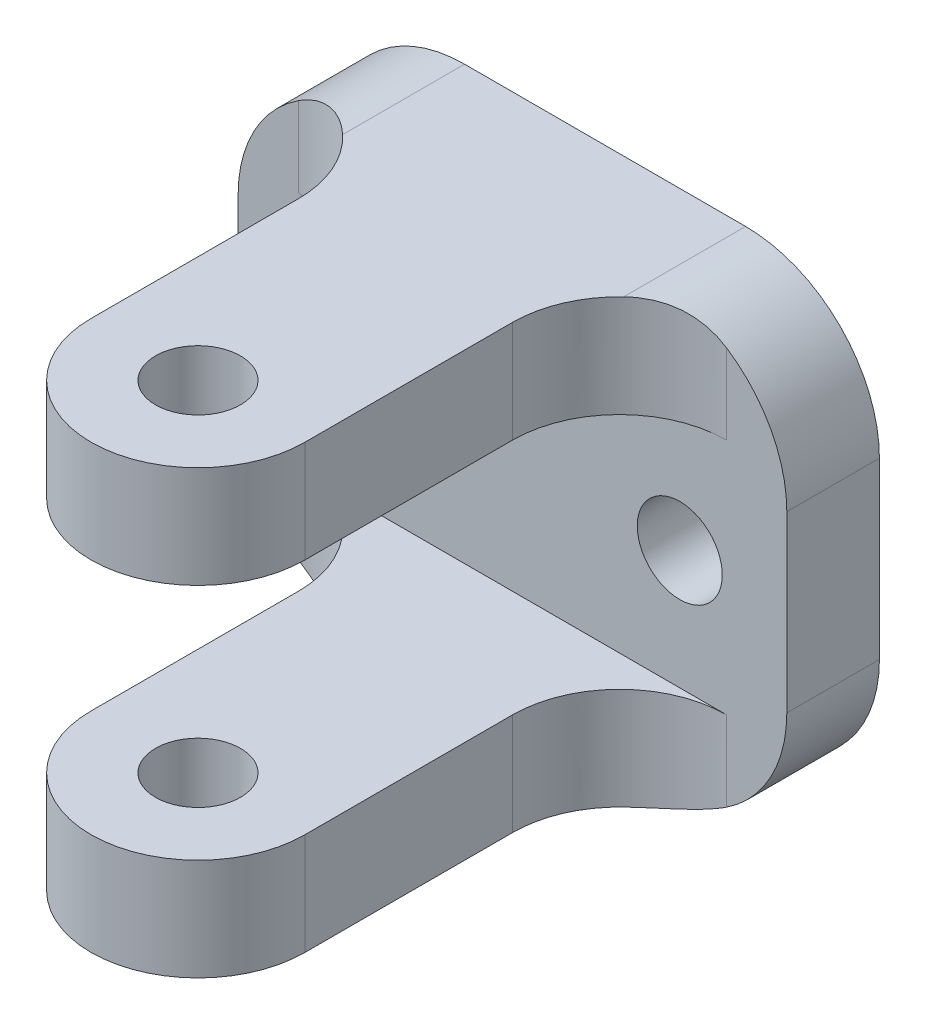
ISO-10303-21;
HEADER;
FILE_DESCRIPTION(('STEP AP214'),'2;1');
FILE_NAME('part.step','',(''),(''),'','','');
FILE_SCHEMA(('AUTOMOTIVE_DESIGN { 1 0 10303 214 1 1 1 1 }'));
ENDSEC;
DATA;
#1=APPLICATION_CONTEXT('core data for automotive mechanical design processes');
#2=APPLICATION_PROTOCOL_DEFINITION('international standard','automotive_design',2000,#1);
#3=PRODUCT_CONTEXT('',#1,'mechanical');
#4=PRODUCT('Part','Part','',(#3));
#5=PRODUCT_RELATED_PRODUCT_CATEGORY('part','',(#4));
#6=PRODUCT_DEFINITION_FORMATION('','',#4);
#7=PRODUCT_DEFINITION_CONTEXT('part definition',#1,'design');
#8=PRODUCT_DEFINITION('design','',#6,#7);
#9=PRODUCT_DEFINITION_SHAPE('','',#8);
#10=(LENGTH_UNIT() NAMED_UNIT(*) SI_UNIT(.MILLI.,.METRE.));
#11=(NAMED_UNIT(*) PLANE_ANGLE_UNIT() SI_UNIT($,.RADIAN.));
#12=(NAMED_UNIT(*) SI_UNIT($,.STERADIAN.) SOLID_ANGLE_UNIT());
#13=UNCERTAINTY_MEASURE_WITH_UNIT(LENGTH_MEASURE(1.E-05),#10,'distance_accuracy_value','');
#14=(GEOMETRIC_REPRESENTATION_CONTEXT(3) GLOBAL_UNCERTAINTY_ASSIGNED_CONTEXT((#13)) GLOBAL_UNIT_ASSIGNED_CONTEXT((#10,
#11,#12)) REPRESENTATION_CONTEXT('',''));
#15=CARTESIAN_POINT('',(0.,0.,0.));
#16=DIRECTION('',(0.,0.,1.));
#17=DIRECTION('',(1.,0.,0.));
#18=AXIS2_PLACEMENT_3D('',#15,#16,#17);
#19=CARTESIAN_POINT('',(20.5,-16.51,12.));
#20=DIRECTION('',(-1.,0.,0.));
#21=DIRECTION('',(0.,0.,1.));
#22=AXIS2_PLACEMENT_3D('',#19,#20,#21);
#23=PLANE('',#22);
#24=DIRECTION('',(0.,-1.,0.));
#25=VECTOR('',#24,1.);
#26=CARTESIAN_POINT('',(20.5,6.51,5.08));
#27=LINE('',#26,#25);
#28=CARTESIAN_POINT('',(20.5,6.51,5.08));
#29=VERTEX_POINT('',#28);
#30=CARTESIAN_POINT('',(20.5,-6.51,5.08));
#31=VERTEX_POINT('',#30);
#32=EDGE_CURVE('E188',#29,#31,#27,.T.);
#33=ORIENTED_EDGE('',*,*,#32,.F.);
#34=DIRECTION('',(0.,0.,-1.));
#35=VECTOR('',#34,1.);
#36=CARTESIAN_POINT('',(20.5,6.51,12.));
#37=LINE('',#36,#35);
#38=CARTESIAN_POINT('',(20.5,6.51,12.));
#39=VERTEX_POINT('',#38);
#40=EDGE_CURVE('E273',#29,#39,#37,.F.);
#41=ORIENTED_EDGE('',*,*,#40,.T.);
#42=DIRECTION('',(0.,1.,0.));
#43=VECTOR('',#42,1.);
#44=CARTESIAN_POINT('',(20.5,-16.51,12.));
#45=LINE('',#44,#43);
#46=CARTESIAN_POINT('',(20.5,-6.51,12.));
#47=VERTEX_POINT('',#46);
#48=EDGE_CURVE('E459',#47,#39,#45,.T.);
#49=ORIENTED_EDGE('',*,*,#48,.F.);
#50=DIRECTION('',(0.,0.,-1.));
#51=VECTOR('',#50,1.);
#52=CARTESIAN_POINT('',(20.5,-6.51,12.));
#53=LINE('',#52,#51);
#54=EDGE_CURVE('E287',#47,#31,#53,.T.);
#55=ORIENTED_EDGE('',*,*,#54,.T.);
#56=EDGE_LOOP('',(#33,#41,#49,#55));
#57=FACE_BOUND('',#56,.T.);
#58=ADVANCED_FACE('F40',(#57),#23,.F.);
#59=CARTESIAN_POINT('',(-20.5,16.51,12.));
#60=DIRECTION('',(0.,-1.,0.));
#61=DIRECTION('',(0.,0.,-1.));
#62=AXIS2_PLACEMENT_3D('',#59,#60,#61);
#63=PLANE('',#62);
#64=CARTESIAN_POINT('',(0.,16.51,35.5));
#65=DIRECTION('',(0.,-1.,0.));
#66=DIRECTION('',(0.,0.,-1.));
#67=AXIS2_PLACEMENT_3D('',#64,#65,#66);
#68=CIRCLE('',#67,3.175);
#69=CARTESIAN_POINT('',(0.,16.51,38.675));
#70=VERTEX_POINT('',#69);
#71=EDGE_CURVE('E430',#70,#70,#68,.T.);
#72=ORIENTED_EDGE('',*,*,#71,.T.);
#73=EDGE_LOOP('',(#72));
#74=FACE_BOUND('',#73,.T.);
#75=DIRECTION('',(1.,0.,0.));
#76=VECTOR('',#75,1.);
#77=CARTESIAN_POINT('',(-10.5,16.51,5.08));
#78=LINE('',#77,#76);
#79=CARTESIAN_POINT('',(-10.5,16.51,5.08));
#80=VERTEX_POINT('',#79);
#81=CARTESIAN_POINT('',(10.5,16.51,5.08));
#82=VERTEX_POINT('',#81);
#83=EDGE_CURVE('E62',#80,#82,#78,.T.);
#84=ORIENTED_EDGE('',*,*,#83,.F.);
#85=DIRECTION('',(0.,0.,-1.));
#86=VECTOR('',#85,1.);
#87=CARTESIAN_POINT('',(-10.5,16.51,12.));
#88=LINE('',#87,#86);
#89=CARTESIAN_POINT('',(-10.5,16.51,14.1905249806889));
#90=VERTEX_POINT('',#89);
#91=EDGE_CURVE('E274',#80,#90,#88,.F.);
#92=ORIENTED_EDGE('',*,*,#91,.T.);
#93=CARTESIAN_POINT('',(-16.,16.51,20.));
#94=DIRECTION('',(0.,-1.,0.));
#95=DIRECTION('',(0.,0.,-1.));
#96=AXIS2_PLACEMENT_3D('',#93,#94,#95);
#97=CIRCLE('',#96,8.);
#98=CARTESIAN_POINT('',(-8.,16.51,20.));
#99=VERTEX_POINT('',#98);
#100=EDGE_CURVE('E517',#90,#99,#97,.T.);
#101=ORIENTED_EDGE('',*,*,#100,.T.);
#102=DIRECTION('',(0.,0.,1.));
#103=VECTOR('',#102,1.);
#104=CARTESIAN_POINT('',(-8.,16.51,35.5));
#105=LINE('',#104,#103);
#106=CARTESIAN_POINT('',(-8.,16.51,35.5));
#107=VERTEX_POINT('',#106);
#108=EDGE_CURVE('E520',#99,#107,#105,.T.);
#109=ORIENTED_EDGE('',*,*,#108,.T.);
#110=CARTESIAN_POINT('',(0.,16.51,35.5));
#111=DIRECTION('',(0.,-1.,0.));
#112=DIRECTION('',(0.,0.,-1.));
#113=AXIS2_PLACEMENT_3D('',#110,#111,#112);
#114=CIRCLE('',#113,8.);
#115=CARTESIAN_POINT('',(8.,16.51,35.5));
#116=VERTEX_POINT('',#115);
#117=EDGE_CURVE('E366',#107,#116,#114,.F.);
#118=ORIENTED_EDGE('',*,*,#117,.T.);
#119=DIRECTION('',(0.,0.,-1.));
#120=VECTOR('',#119,1.);
#121=CARTESIAN_POINT('',(8.,16.51,35.5));
#122=LINE('',#121,#120);
#123=CARTESIAN_POINT('',(8.,16.51,20.));
#124=VERTEX_POINT('',#123);
#125=EDGE_CURVE('E357',#116,#124,#122,.T.);
#126=ORIENTED_EDGE('',*,*,#125,.T.);
#127=CARTESIAN_POINT('',(16.,16.51,20.));
#128=DIRECTION('',(0.,-1.,0.));
#129=DIRECTION('',(0.,0.,-1.));
#130=AXIS2_PLACEMENT_3D('',#127,#128,#129);
#131=CIRCLE('',#130,8.);
#132=CARTESIAN_POINT('',(10.5,16.51,14.1905249806889));
#133=VERTEX_POINT('',#132);
#134=EDGE_CURVE('E354',#124,#133,#131,.T.);
#135=ORIENTED_EDGE('',*,*,#134,.T.);
#136=DIRECTION('',(0.,0.,-1.));
#137=VECTOR('',#136,1.);
#138=CARTESIAN_POINT('',(10.5,16.51,12.));
#139=LINE('',#138,#137);
#140=EDGE_CURVE('E249',#133,#82,#139,.T.);
#141=ORIENTED_EDGE('',*,*,#140,.T.);
#142=EDGE_LOOP('',(#84,#92,#101,#109,#118,#126,#135,#141));
#143=FACE_BOUND('',#142,.T.);
#144=ADVANCED_FACE('F327',(#74,#143),#63,.F.);
#145=CARTESIAN_POINT('',(-20.5,-16.51,12.));
#146=DIRECTION('',(1.,0.,0.));
#147=DIRECTION('',(0.,0.,-1.));
#148=AXIS2_PLACEMENT_3D('',#145,#146,#147);
#149=PLANE('',#148);
#150=DIRECTION('',(0.,1.,0.));
#151=VECTOR('',#150,1.);
#152=CARTESIAN_POINT('',(-20.5,-6.51,5.08));
#153=LINE('',#152,#151);
#154=CARTESIAN_POINT('',(-20.5,-6.51,5.08));
#155=VERTEX_POINT('',#154);
#156=CARTESIAN_POINT('',(-20.5,6.51,5.08));
#157=VERTEX_POINT('',#156);
#158=EDGE_CURVE('E498',#155,#157,#153,.T.);
#159=ORIENTED_EDGE('',*,*,#158,.F.);
#160=DIRECTION('',(0.,0.,-1.));
#161=VECTOR('',#160,1.);
#162=CARTESIAN_POINT('',(-20.5,-6.51,12.));
#163=LINE('',#162,#161);
#164=CARTESIAN_POINT('',(-20.5,-6.51,12.));
#165=VERTEX_POINT('',#164);
#166=EDGE_CURVE('E225',#155,#165,#163,.F.);
#167=ORIENTED_EDGE('',*,*,#166,.T.);
#168=DIRECTION('',(0.,-1.,0.));
#169=VECTOR('',#168,1.);
#170=CARTESIAN_POINT('',(-20.5,-16.51,12.));
#171=LINE('',#170,#169);
#172=CARTESIAN_POINT('',(-20.5,6.51,12.));
#173=VERTEX_POINT('',#172);
#174=EDGE_CURVE('E462',#173,#165,#171,.T.);
#175=ORIENTED_EDGE('',*,*,#174,.F.);
#176=DIRECTION('',(0.,0.,-1.));
#177=VECTOR('',#176,1.);
#178=CARTESIAN_POINT('',(-20.5,6.51,12.));
#179=LINE('',#178,#177);
#180=EDGE_CURVE('E215',#173,#157,#179,.T.);
#181=ORIENTED_EDGE('',*,*,#180,.T.);
#182=EDGE_LOOP('',(#159,#167,#175,#181));
#183=FACE_BOUND('',#182,.T.);
#184=ADVANCED_FACE('F323',(#183),#149,.F.);
#185=CARTESIAN_POINT('',(-20.5,-16.51,12.));
#186=DIRECTION('',(0.,1.,0.));
#187=DIRECTION('',(0.,0.,1.));
#188=AXIS2_PLACEMENT_3D('',#185,#186,#187);
#189=PLANE('',#188);
#190=CARTESIAN_POINT('',(0.,-16.51,35.5));
#191=DIRECTION('',(0.,1.,0.));
#192=DIRECTION('',(0.,0.,1.));
#193=AXIS2_PLACEMENT_3D('',#190,#191,#192);
#194=CIRCLE('',#193,3.175);
#195=CARTESIAN_POINT('',(0.,-16.51,38.675));
#196=VERTEX_POINT('',#195);
#197=EDGE_CURVE('E434',#196,#196,#194,.F.);
#198=ORIENTED_EDGE('',*,*,#197,.F.);
#199=EDGE_LOOP('',(#198));
#200=FACE_BOUND('',#199,.T.);
#201=DIRECTION('',(-1.,0.,0.));
#202=VECTOR('',#201,1.);
#203=CARTESIAN_POINT('',(10.5,-16.51,5.08));
#204=LINE('',#203,#202);
#205=CARTESIAN_POINT('',(10.5,-16.51,5.08));
#206=VERTEX_POINT('',#205);
#207=CARTESIAN_POINT('',(-10.5,-16.51,5.08));
#208=VERTEX_POINT('',#207);
#209=EDGE_CURVE('E185',#206,#208,#204,.T.);
#210=ORIENTED_EDGE('',*,*,#209,.F.);
#211=DIRECTION('',(0.,0.,-1.));
#212=VECTOR('',#211,1.);
#213=CARTESIAN_POINT('',(10.5,-16.51,12.));
#214=LINE('',#213,#212);
#215=CARTESIAN_POINT('',(10.5,-16.51,14.1905249806889));
#216=VERTEX_POINT('',#215);
#217=EDGE_CURVE('E199',#206,#216,#214,.F.);
#218=ORIENTED_EDGE('',*,*,#217,.T.);
#219=CARTESIAN_POINT('',(16.,-16.51,20.));
#220=DIRECTION('',(0.,1.,0.));
#221=DIRECTION('',(0.,0.,1.));
#222=AXIS2_PLACEMENT_3D('',#219,#220,#221);
#223=CIRCLE('',#222,8.);
#224=CARTESIAN_POINT('',(8.,-16.51,20.));
#225=VERTEX_POINT('',#224);
#226=EDGE_CURVE('E370',#225,#216,#223,.F.);
#227=ORIENTED_EDGE('',*,*,#226,.F.);
#228=DIRECTION('',(0.,0.,-1.));
#229=VECTOR('',#228,1.);
#230=CARTESIAN_POINT('',(8.,-16.51,35.5));
#231=LINE('',#230,#229);
#232=CARTESIAN_POINT('',(8.,-16.51,35.5));
#233=VERTEX_POINT('',#232);
#234=EDGE_CURVE('E373',#233,#225,#231,.T.);
#235=ORIENTED_EDGE('',*,*,#234,.F.);
#236=CARTESIAN_POINT('',(0.,-16.51,35.5));
#237=DIRECTION('',(0.,1.,0.));
#238=DIRECTION('',(0.,0.,1.));
#239=AXIS2_PLACEMENT_3D('',#236,#237,#238);
#240=CIRCLE('',#239,8.);
#241=CARTESIAN_POINT('',(-8.,-16.51,35.5));
#242=VERTEX_POINT('',#241);
#243=EDGE_CURVE('E377',#242,#233,#240,.T.);
#244=ORIENTED_EDGE('',*,*,#243,.F.);
#245=DIRECTION('',(0.,0.,1.));
#246=VECTOR('',#245,1.);
#247=CARTESIAN_POINT('',(-8.,-16.51,35.5));
#248=LINE('',#247,#246);
#249=CARTESIAN_POINT('',(-8.,-16.51,20.));
#250=VERTEX_POINT('',#249);
#251=EDGE_CURVE('E380',#250,#242,#248,.T.);
#252=ORIENTED_EDGE('',*,*,#251,.F.);
#253=CARTESIAN_POINT('',(-16.,-16.51,20.));
#254=DIRECTION('',(0.,1.,0.));
#255=DIRECTION('',(0.,0.,1.));
#256=AXIS2_PLACEMENT_3D('',#253,#254,#255);
#257=CIRCLE('',#256,8.);
#258=CARTESIAN_POINT('',(-10.5,-16.51,14.1905249806889));
#259=VERTEX_POINT('',#258);
#260=EDGE_CURVE('E383',#259,#250,#257,.F.);
#261=ORIENTED_EDGE('',*,*,#260,.F.);
#262=DIRECTION('',(0.,0.,-1.));
#263=VECTOR('',#262,1.);
#264=CARTESIAN_POINT('',(-10.5,-16.51,12.));
#265=LINE('',#264,#263);
#266=EDGE_CURVE('E203',#259,#208,#265,.T.);
#267=ORIENTED_EDGE('',*,*,#266,.T.);
#268=EDGE_LOOP('',(#210,#218,#227,#235,#244,#252,#261,#267));
#269=FACE_BOUND('',#268,.T.);
#270=ADVANCED_FACE('F197',(#200,#269),#189,.F.);
#271=CARTESIAN_POINT('',(12.5,0.,12.));
#272=DIRECTION('',(0.,0.,-1.));
#273=DIRECTION('',(-1.,0.,0.));
#274=AXIS2_PLACEMENT_3D('',#271,#272,#273);
#275=CYLINDRICAL_SURFACE('',#274,3.175);
#276=CARTESIAN_POINT('',(12.5,0.,12.));
#277=DIRECTION('',(0.,0.,1.));
#278=DIRECTION('',(1.,0.,0.));
#279=AXIS2_PLACEMENT_3D('',#276,#277,#278);
#280=CIRCLE('',#279,3.175);
#281=CARTESIAN_POINT('',(15.675,0.,12.));
#282=VERTEX_POINT('',#281);
#283=EDGE_CURVE('E455',#282,#282,#280,.T.);
#284=ORIENTED_EDGE('',*,*,#283,.T.);
#285=EDGE_LOOP('',(#284));
#286=FACE_BOUND('',#285,.T.);
#287=CARTESIAN_POINT('',(12.5,0.,5.08));
#288=DIRECTION('',(0.,0.,-1.));
#289=DIRECTION('',(-1.,0.,0.));
#290=AXIS2_PLACEMENT_3D('',#287,#288,#289);
#291=CIRCLE('',#290,3.175);
#292=CARTESIAN_POINT('',(9.325,0.,5.08));
#293=VERTEX_POINT('',#292);
#294=EDGE_CURVE('E513',#293,#293,#291,.T.);
#295=ORIENTED_EDGE('',*,*,#294,.T.);
#296=EDGE_LOOP('',(#295));
#297=FACE_BOUND('',#296,.T.);
#298=ADVANCED_FACE('F313',(#286,#297),#275,.F.);
#299=CARTESIAN_POINT('',(-12.5,0.,12.));
#300=DIRECTION('',(0.,0.,-1.));
#301=DIRECTION('',(-1.,0.,0.));
#302=AXIS2_PLACEMENT_3D('',#299,#300,#301);
#303=CYLINDRICAL_SURFACE('',#302,3.175);
#304=CARTESIAN_POINT('',(-12.5,0.,12.));
#305=DIRECTION('',(0.,0.,1.));
#306=DIRECTION('',(1.,0.,0.));
#307=AXIS2_PLACEMENT_3D('',#304,#305,#306);
#308=CIRCLE('',#307,3.175);
#309=CARTESIAN_POINT('',(-9.325,0.,12.));
#310=VERTEX_POINT('',#309);
#311=EDGE_CURVE('E451',#310,#310,#308,.T.);
#312=ORIENTED_EDGE('',*,*,#311,.T.);
#313=EDGE_LOOP('',(#312));
#314=FACE_BOUND('',#313,.T.);
#315=CARTESIAN_POINT('',(-12.5,0.,5.08));
#316=DIRECTION('',(0.,0.,-1.));
#317=DIRECTION('',(-1.,0.,0.));
#318=AXIS2_PLACEMENT_3D('',#315,#316,#317);
#319=CIRCLE('',#318,3.175);
#320=CARTESIAN_POINT('',(-15.675,0.,5.08));
#321=VERTEX_POINT('',#320);
#322=EDGE_CURVE('E340',#321,#321,#319,.T.);
#323=ORIENTED_EDGE('',*,*,#322,.T.);
#324=EDGE_LOOP('',(#323));
#325=FACE_BOUND('',#324,.T.);
#326=ADVANCED_FACE('F310',(#314,#325),#303,.F.);
#327=CARTESIAN_POINT('',(-10.5,-6.51,12.));
#328=DIRECTION('',(0.,0.,-1.));
#329=DIRECTION('',(-1.,0.,0.));
#330=AXIS2_PLACEMENT_3D('',#327,#328,#329);
#331=CYLINDRICAL_SURFACE('',#330,10.);
#332=ORIENTED_EDGE('',*,*,#166,.F.);
#333=CARTESIAN_POINT('',(-10.5,-6.51,5.08));
#334=DIRECTION('',(0.,0.,-1.));
#335=DIRECTION('',(-1.,0.,0.));
#336=AXIS2_PLACEMENT_3D('',#333,#334,#335);
#337=CIRCLE('',#336,10.);
#338=EDGE_CURVE('E205',#208,#155,#337,.T.);
#339=ORIENTED_EDGE('',*,*,#338,.F.);
#340=ORIENTED_EDGE('',*,*,#266,.F.);
#341=CARTESIAN_POINT('',(-16.,-14.861646544245,12.));
#342=CARTESIAN_POINT('',(-15.8406390175342,-14.9666346961261,11.9999773486859));
#343=CARTESIAN_POINT('',(-15.6781927679576,-15.0670340152452,12.0047616823777));
#344=CARTESIAN_POINT('',(-15.3482407665293,-15.2581857287704,12.0248855274601));
#345=CARTESIAN_POINT('',(-15.1807322371773,-15.3489326991728,12.0402309376997));
#346=CARTESIAN_POINT('',(-14.842333925003,-15.519996597423,12.0823721509199));
#347=CARTESIAN_POINT('',(-14.6714527258065,-15.6003368427069,12.1091417572519));
#348=CARTESIAN_POINT('',(-14.3274378196099,-15.750450103068,12.1748364161036));
#349=CARTESIAN_POINT('',(-14.1543046355359,-15.8202255254262,12.2137586933301));
#350=CARTESIAN_POINT('',(-13.8065842208315,-15.9493351897276,12.3044590524056));
#351=CARTESIAN_POINT('',(-13.6319939443628,-16.0086221225154,12.3562929656252));
#352=CARTESIAN_POINT('',(-13.2838167253846,-16.1164343840874,12.4729780191308));
#353=CARTESIAN_POINT('',(-13.1102298996766,-16.1649584837042,12.5378306446067));
#354=CARTESIAN_POINT('',(-12.7658628361083,-16.2515288176306,12.6804996316999));
#355=CARTESIAN_POINT('',(-12.5950817815399,-16.2895781536468,12.758312144757));
#356=CARTESIAN_POINT('',(-12.2579466427851,-16.3557669889002,12.9266329374261));
#357=CARTESIAN_POINT('',(-12.0915917985458,-16.3839081998103,13.0171390203856));
#358=CARTESIAN_POINT('',(-11.800310226014,-16.4259421877124,13.1893684576741));
#359=CARTESIAN_POINT('',(-11.6742310763261,-16.4416019970572,13.2687318633785));
#360=CARTESIAN_POINT('',(-11.4263394869415,-16.4677821892239,13.434646170847));
#361=CARTESIAN_POINT('',(-11.3045269803384,-16.4783026526707,13.5211969598321));
#362=CARTESIAN_POINT('',(-11.065770564703,-16.4946992427489,13.7011338226893));
#363=CARTESIAN_POINT('',(-10.9488260071075,-16.5005759899568,13.7945189814075));
#364=CARTESIAN_POINT('',(-10.7202841230381,-16.5082281673317,13.9877596888987));
#365=CARTESIAN_POINT('',(-10.6086863472399,-16.5100039427237,14.0876146923045));
#366=CARTESIAN_POINT('',(-10.5,-16.51,14.1905249806889));
#367=B_SPLINE_CURVE_WITH_KNOTS('',3,(#341,#342,#343,#344,#345,#346,#347,#348,#349,#350,#351,
#352,#353,#354,#355,#356,#357,#358,#359,#360,#361,#362,#363,#364,#365,#366),.UNSPECIFIED.,.F.,
.F.,(4,2,2,2,2,2,2,2,2,2,2,2,4),(0.,0.572446979802288,1.14521395745737,1.71667453014939,
2.28800469429968,2.86184959536753,3.43575999857619,4.0095002765897,4.58314138971889,
5.03222792695074,5.48130741878281,5.93032688641021,6.37930855363194),.UNSPECIFIED.);
#368=CARTESIAN_POINT('',(-16.,-14.8616465442451,12.));
#369=VERTEX_POINT('',#368);
#370=EDGE_CURVE('E240',#369,#259,#367,.T.);
#371=ORIENTED_EDGE('',*,*,#370,.F.);
#372=CARTESIAN_POINT('',(-10.5,-6.51,12.));
#373=DIRECTION('',(0.,0.,-1.));
#374=DIRECTION('',(-1.,0.,0.));
#375=AXIS2_PLACEMENT_3D('',#372,#373,#374);
#376=CIRCLE('',#375,10.);
#377=EDGE_CURVE('E237',#165,#369,#376,.F.);
#378=ORIENTED_EDGE('',*,*,#377,.F.);
#379=EDGE_LOOP('',(#332,#339,#340,#371,#378));
#380=FACE_BOUND('',#379,.T.);
#381=ADVANCED_FACE('F251',(#380),#331,.T.);
#382=CARTESIAN_POINT('',(-10.5,6.51,12.));
#383=DIRECTION('',(0.,0.,-1.));
#384=DIRECTION('',(-1.,0.,0.));
#385=AXIS2_PLACEMENT_3D('',#382,#383,#384);
#386=CYLINDRICAL_SURFACE('',#385,10.);
#387=ORIENTED_EDGE('',*,*,#91,.F.);
#388=CARTESIAN_POINT('',(-10.5,6.51,5.08));
#389=DIRECTION('',(0.,0.,-1.));
#390=DIRECTION('',(-1.,0.,0.));
#391=AXIS2_PLACEMENT_3D('',#388,#389,#390);
#392=CIRCLE('',#391,10.);
#393=EDGE_CURVE('E501',#157,#80,#392,.T.);
#394=ORIENTED_EDGE('',*,*,#393,.F.);
#395=ORIENTED_EDGE('',*,*,#180,.F.);
#396=CARTESIAN_POINT('',(-10.5,6.51,12.));
#397=DIRECTION('',(0.,0.,-1.));
#398=DIRECTION('',(-1.,0.,0.));
#399=AXIS2_PLACEMENT_3D('',#396,#397,#398);
#400=CIRCLE('',#399,10.);
#401=CARTESIAN_POINT('',(-16.,14.861646544245,12.));
#402=VERTEX_POINT('',#401);
#403=EDGE_CURVE('E234',#402,#173,#400,.F.);
#404=ORIENTED_EDGE('',*,*,#403,.F.);
#405=CARTESIAN_POINT('',(-10.5,16.51,14.1905249806889));
#406=CARTESIAN_POINT('',(-10.6385905076174,16.5100124707479,14.0592779526813));
#407=CARTESIAN_POINT('',(-10.7819437931911,16.5071192931788,13.9330061802224));
#408=CARTESIAN_POINT('',(-11.0771804914547,16.4944198218968,13.6911043721401));
#409=CARTESIAN_POINT('',(-11.2290678650654,16.4846102932991,13.5754793447867));
#410=CARTESIAN_POINT('',(-11.5399428074204,16.4570011199483,13.3559003733543));
#411=CARTESIAN_POINT('',(-11.698915983624,16.4392170615019,13.2519241546606));
#412=CARTESIAN_POINT('',(-12.0229016970291,16.3947100739277,13.0560454081363));
#413=CARTESIAN_POINT('',(-12.1879130541584,16.3679888832069,12.9641405370845));
#414=CARTESIAN_POINT('',(-12.5232261794013,16.3046813182327,12.7925273621917));
#415=CARTESIAN_POINT('',(-12.6935470431496,16.268054507108,12.7128711985689));
#416=CARTESIAN_POINT('',(-13.0371988189976,16.1843937068261,12.5665156159983));
#417=CARTESIAN_POINT('',(-13.2105300211182,16.1373587097442,12.4998174530739));
#418=CARTESIAN_POINT('',(-13.5583864264666,16.0325656510807,12.379476053191));
#419=CARTESIAN_POINT('',(-13.7329111052907,15.9748120399576,12.3258274192429));
#420=CARTESIAN_POINT('',(-14.0814820011126,15.8484867822336,12.2313524064613));
#421=CARTESIAN_POINT('',(-14.2555282986759,15.7799170872823,12.1905237183692));
#422=CARTESIAN_POINT('',(-14.5638479921024,15.6482066096535,12.1287525423828));
#423=CARTESIAN_POINT('',(-14.69853550601,15.5871308572021,12.1054160803613));
#424=CARTESIAN_POINT('',(-14.9659083430294,15.4586122006368,12.0659649821987));
#425=CARTESIAN_POINT('',(-15.0985937899693,15.3911696921954,12.0498498976305));
#426=CARTESIAN_POINT('',(-15.3613242415198,15.250122849356,12.0244429742811));
#427=CARTESIAN_POINT('',(-15.4913689320857,15.1765177873638,12.0151519424645));
#428=CARTESIAN_POINT('',(-15.748234151168,15.0234277503611,12.0029271301925));
#429=CARTESIAN_POINT('',(-15.8750551562842,14.9439436513997,11.9999924045347));
#430=CARTESIAN_POINT('',(-16.,14.861646544245,12.));
#431=B_SPLINE_CURVE_WITH_KNOTS('',3,(#405,#406,#407,#408,#409,#410,#411,#412,#413,#414,#415,
#416,#417,#418,#419,#420,#421,#422,#423,#424,#425,#426,#427,#428,#429,#430),.UNSPECIFIED.,.F.,
.F.,(4,2,2,2,2,2,2,2,2,2,2,2,4),(0.,0.572535620150681,1.14533920190051,1.71702807985692,
2.28860582030931,2.86255303398867,3.43655585284524,4.01032087195247,4.58398247932137,
5.03282465175146,5.48163894849237,5.93050631031846,6.37930691959681),.UNSPECIFIED.);
#432=EDGE_CURVE('E266',#90,#402,#431,.T.);
#433=ORIENTED_EDGE('',*,*,#432,.F.);
#434=EDGE_LOOP('',(#387,#394,#395,#404,#433));
#435=FACE_BOUND('',#434,.T.);
#436=ADVANCED_FACE('F276',(#435),#386,.T.);
#437=CARTESIAN_POINT('',(10.5,-6.51,12.));
#438=DIRECTION('',(0.,0.,-1.));
#439=DIRECTION('',(-1.,0.,0.));
#440=AXIS2_PLACEMENT_3D('',#437,#438,#439);
#441=CYLINDRICAL_SURFACE('',#440,10.);
#442=ORIENTED_EDGE('',*,*,#217,.F.);
#443=CARTESIAN_POINT('',(10.5,-6.51,5.08));
#444=DIRECTION('',(0.,0.,-1.));
#445=DIRECTION('',(-1.,0.,0.));
#446=AXIS2_PLACEMENT_3D('',#443,#444,#445);
#447=CIRCLE('',#446,10.);
#448=EDGE_CURVE('E182',#31,#206,#447,.T.);
#449=ORIENTED_EDGE('',*,*,#448,.F.);
#450=ORIENTED_EDGE('',*,*,#54,.F.);
#451=CARTESIAN_POINT('',(10.5,-6.51,12.));
#452=DIRECTION('',(0.,0.,-1.));
#453=DIRECTION('',(-1.,0.,0.));
#454=AXIS2_PLACEMENT_3D('',#451,#452,#453);
#455=CIRCLE('',#454,10.);
#456=CARTESIAN_POINT('',(16.,-14.8616465442451,12.));
#457=VERTEX_POINT('',#456);
#458=EDGE_CURVE('E231',#457,#47,#455,.F.);
#459=ORIENTED_EDGE('',*,*,#458,.F.);
#460=CARTESIAN_POINT('',(10.5,-16.51,14.1905249806889));
#461=CARTESIAN_POINT('',(10.6385905076174,-16.5100124707479,14.0592779526813));
#462=CARTESIAN_POINT('',(10.7819437931911,-16.5071192931788,13.9330061802224));
#463=CARTESIAN_POINT('',(11.0771804914547,-16.4944198218968,13.6911043721402));
#464=CARTESIAN_POINT('',(11.2290678650654,-16.4846102932991,13.5754793447867));
#465=CARTESIAN_POINT('',(11.5399428074203,-16.4570011199483,13.3559003733543));
#466=CARTESIAN_POINT('',(11.6989159836239,-16.4392170615019,13.2519241546607));
#467=CARTESIAN_POINT('',(12.0229016970291,-16.3947100739277,13.0560454081363));
#468=CARTESIAN_POINT('',(12.1879130541584,-16.3679888832069,12.9641405370845));
#469=CARTESIAN_POINT('',(12.5232261794013,-16.3046813182327,12.7925273621918));
#470=CARTESIAN_POINT('',(12.6935470431496,-16.268054507108,12.7128711985689));
#471=CARTESIAN_POINT('',(13.0371988189976,-16.1843937068261,12.5665156159983));
#472=CARTESIAN_POINT('',(13.2105300211182,-16.1373587097442,12.4998174530739));
#473=CARTESIAN_POINT('',(13.5583864264666,-16.0325656510807,12.379476053191));
#474=CARTESIAN_POINT('',(13.7329111052907,-15.9748120399576,12.3258274192429));
#475=CARTESIAN_POINT('',(14.0814820011126,-15.8484867822336,12.2313524064613));
#476=CARTESIAN_POINT('',(14.2555282986759,-15.7799170872823,12.1905237183692));
#477=CARTESIAN_POINT('',(14.5638479921024,-15.6482066096536,12.1287525423828));
#478=CARTESIAN_POINT('',(14.69853550601,-15.5871308572021,12.1054160803613));
#479=CARTESIAN_POINT('',(14.9659083430294,-15.4586122006368,12.0659649821987));
#480=CARTESIAN_POINT('',(15.0985937899693,-15.3911696921954,12.0498498976305));
#481=CARTESIAN_POINT('',(15.3613242415198,-15.250122849356,12.0244429742811));
#482=CARTESIAN_POINT('',(15.4913689320857,-15.1765177873638,12.0151519424645));
#483=CARTESIAN_POINT('',(15.748234151168,-15.0234277503611,12.0029271301925));
#484=CARTESIAN_POINT('',(15.8750551562842,-14.9439436513997,11.9999924045347));
#485=CARTESIAN_POINT('',(16.,-14.861646544245,12.));
#486=B_SPLINE_CURVE_WITH_KNOTS('',3,(#460,#461,#462,#463,#464,#465,#466,#467,#468,#469,#470,
#471,#472,#473,#474,#475,#476,#477,#478,#479,#480,#481,#482,#483,#484,#485),.UNSPECIFIED.,.F.,
.F.,(4,2,2,2,2,2,2,2,2,2,2,2,4),(0.,0.57253562015068,1.14533920190051,1.71702807985692,
2.2886058203093,2.86255303398866,3.43655585284523,4.01032087195246,4.58398247932136,
5.03282465175145,5.48163894849236,5.93050631031846,6.37930691959681),.UNSPECIFIED.);
#487=EDGE_CURVE('E55',#216,#457,#486,.T.);
#488=ORIENTED_EDGE('',*,*,#487,.F.);
#489=EDGE_LOOP('',(#442,#449,#450,#459,#488));
#490=FACE_BOUND('',#489,.T.);
#491=ADVANCED_FACE('F208',(#490),#441,.T.);
#492=CARTESIAN_POINT('',(10.5,6.51,12.));
#493=DIRECTION('',(0.,0.,-1.));
#494=DIRECTION('',(-1.,0.,0.));
#495=AXIS2_PLACEMENT_3D('',#492,#493,#494);
#496=CYLINDRICAL_SURFACE('',#495,10.);
#497=ORIENTED_EDGE('',*,*,#40,.F.);
#498=CARTESIAN_POINT('',(10.5,6.51,5.08));
#499=DIRECTION('',(0.,0.,-1.));
#500=DIRECTION('',(-1.,0.,0.));
#501=AXIS2_PLACEMENT_3D('',#498,#499,#500);
#502=CIRCLE('',#501,10.);
#503=EDGE_CURVE('E341',#82,#29,#502,.T.);
#504=ORIENTED_EDGE('',*,*,#503,.F.);
#505=ORIENTED_EDGE('',*,*,#140,.F.);
#506=CARTESIAN_POINT('',(16.,14.861646544245,12.));
#507=CARTESIAN_POINT('',(15.8406390175342,14.9666346961261,11.9999773486859));
#508=CARTESIAN_POINT('',(15.6781927679576,15.0670340152452,12.0047616823777));
#509=CARTESIAN_POINT('',(15.3482407665293,15.2581857287704,12.0248855274601));
#510=CARTESIAN_POINT('',(15.1807322371773,15.3489326991728,12.0402309376997));
#511=CARTESIAN_POINT('',(14.842333925003,15.519996597423,12.0823721509199));
#512=CARTESIAN_POINT('',(14.6714527258065,15.6003368427069,12.1091417572519));
#513=CARTESIAN_POINT('',(14.3274378196099,15.750450103068,12.1748364161036));
#514=CARTESIAN_POINT('',(14.1543046355359,15.8202255254262,12.2137586933301));
#515=CARTESIAN_POINT('',(13.8065842208315,15.9493351897276,12.3044590524056));
#516=CARTESIAN_POINT('',(13.6319939443628,16.0086221225154,12.3562929656252));
#517=CARTESIAN_POINT('',(13.2838167253846,16.1164343840874,12.4729780191308));
#518=CARTESIAN_POINT('',(13.1102298996766,16.1649584837042,12.5378306446067));
#519=CARTESIAN_POINT('',(12.7658628361083,16.2515288176306,12.6804996316999));
#520=CARTESIAN_POINT('',(12.5950817815399,16.2895781536468,12.758312144757));
#521=CARTESIAN_POINT('',(12.2579466427851,16.3557669889002,12.9266329374261));
#522=CARTESIAN_POINT('',(12.0915917985458,16.3839081998103,13.0171390203856));
#523=CARTESIAN_POINT('',(11.800310226014,16.4259421877124,13.1893684576741));
#524=CARTESIAN_POINT('',(11.6742310763261,16.4416019970572,13.2687318633785));
#525=CARTESIAN_POINT('',(11.4263394869415,16.4677821892239,13.434646170847));
#526=CARTESIAN_POINT('',(11.3045269803384,16.4783026526707,13.5211969598321));
#527=CARTESIAN_POINT('',(11.065770564703,16.4946992427489,13.7011338226893));
#528=CARTESIAN_POINT('',(10.9488260071075,16.5005759899568,13.7945189814075));
#529=CARTESIAN_POINT('',(10.7202841230381,16.5082281673317,13.9877596888987));
#530=CARTESIAN_POINT('',(10.6086863472398,16.5100039427237,14.0876146923045));
#531=CARTESIAN_POINT('',(10.5,16.51,14.1905249806889));
#532=B_SPLINE_CURVE_WITH_KNOTS('',3,(#506,#507,#508,#509,#510,#511,#512,#513,#514,#515,#516,
#517,#518,#519,#520,#521,#522,#523,#524,#525,#526,#527,#528,#529,#530,#531),.UNSPECIFIED.,.F.,
.F.,(4,2,2,2,2,2,2,2,2,2,2,2,4),(0.,0.572446979802291,1.14521395745738,1.7166745301494,
2.28800469429969,2.86184959536755,3.43575999857621,4.00950027658972,4.58314138971892,
5.03222792695077,5.48130741878283,5.93032688641024,6.37930855363197),.UNSPECIFIED.);
#533=CARTESIAN_POINT('',(16.,14.861646544245,12.));
#534=VERTEX_POINT('',#533);
#535=EDGE_CURVE('E11',#534,#133,#532,.T.);
#536=ORIENTED_EDGE('',*,*,#535,.F.);
#537=CARTESIAN_POINT('',(10.5,6.51,12.));
#538=DIRECTION('',(0.,0.,-1.));
#539=DIRECTION('',(-1.,0.,0.));
#540=AXIS2_PLACEMENT_3D('',#537,#538,#539);
#541=CIRCLE('',#540,10.);
#542=EDGE_CURVE('E228',#39,#534,#541,.F.);
#543=ORIENTED_EDGE('',*,*,#542,.F.);
#544=EDGE_LOOP('',(#497,#504,#505,#536,#543));
#545=FACE_BOUND('',#544,.T.);
#546=ADVANCED_FACE('F42',(#545),#496,.T.);
#547=CARTESIAN_POINT('',(0.,0.,12.));
#548=DIRECTION('',(0.,0.,-1.));
#549=DIRECTION('',(-1.,0.,0.));
#550=AXIS2_PLACEMENT_3D('',#547,#548,#549);
#551=PLANE('',#550);
#552=ORIENTED_EDGE('',*,*,#174,.T.);
#553=ORIENTED_EDGE('',*,*,#377,.T.);
#554=DIRECTION('',(0.,1.,0.));
#555=VECTOR('',#554,1.);
#556=CARTESIAN_POINT('',(-16.,-83.5174622710038,12.));
#557=LINE('',#556,#555);
#558=CARTESIAN_POINT('',(-16.,-8.89000000000002,12.));
#559=VERTEX_POINT('',#558);
#560=EDGE_CURVE('E374',#369,#559,#557,.T.);
#561=ORIENTED_EDGE('',*,*,#560,.T.);
#562=DIRECTION('',(-1.,0.,0.));
#563=VECTOR('',#562,1.);
#564=CARTESIAN_POINT('',(-20.5,-8.89,12.));
#565=LINE('',#564,#563);
#566=CARTESIAN_POINT('',(16.,-8.89000000000001,12.));
#567=VERTEX_POINT('',#566);
#568=EDGE_CURVE('E443',#567,#559,#565,.T.);
#569=ORIENTED_EDGE('',*,*,#568,.F.);
#570=DIRECTION('',(0.,1.,0.));
#571=VECTOR('',#570,1.);
#572=CARTESIAN_POINT('',(16.,-83.5174622710038,12.));
#573=LINE('',#572,#571);
#574=EDGE_CURVE('E364',#457,#567,#573,.T.);
#575=ORIENTED_EDGE('',*,*,#574,.F.);
#576=ORIENTED_EDGE('',*,*,#458,.T.);
#577=ORIENTED_EDGE('',*,*,#48,.T.);
#578=ORIENTED_EDGE('',*,*,#542,.T.);
#579=CARTESIAN_POINT('',(16.,8.89,12.));
#580=VERTEX_POINT('',#579);
#581=EDGE_CURVE('E360',#580,#534,#573,.T.);
#582=ORIENTED_EDGE('',*,*,#581,.F.);
#583=DIRECTION('',(1.,0.,0.));
#584=VECTOR('',#583,1.);
#585=CARTESIAN_POINT('',(-20.5,8.89,12.));
#586=LINE('',#585,#584);
#587=CARTESIAN_POINT('',(-16.,8.88999999999997,12.));
#588=VERTEX_POINT('',#587);
#589=EDGE_CURVE('E447',#588,#580,#586,.T.);
#590=ORIENTED_EDGE('',*,*,#589,.F.);
#591=EDGE_CURVE('E389',#588,#402,#557,.T.);
#592=ORIENTED_EDGE('',*,*,#591,.T.);
#593=ORIENTED_EDGE('',*,*,#403,.T.);
#594=EDGE_LOOP('',(#552,#553,#561,#569,#575,#576,#577,#578,#582,#590,#592,#593));
#595=FACE_BOUND('',#594,.T.);
#596=ORIENTED_EDGE('',*,*,#311,.F.);
#597=EDGE_LOOP('',(#596));
#598=FACE_BOUND('',#597,.T.);
#599=ORIENTED_EDGE('',*,*,#283,.F.);
#600=EDGE_LOOP('',(#599));
#601=FACE_BOUND('',#600,.T.);
#602=ADVANCED_FACE('F308',(#595,#598,#601),#551,.F.);
#603=CARTESIAN_POINT('',(-20.5,8.89,65.));
#604=DIRECTION('',(0.,1.,0.));
#605=DIRECTION('',(-1.,0.,0.));
#606=AXIS2_PLACEMENT_3D('',#603,#604,#605);
#607=PLANE('',#606);
#608=CARTESIAN_POINT('',(0.,8.89,35.5));
#609=DIRECTION('',(0.,1.,0.));
#610=DIRECTION('',(-1.,0.,0.));
#611=AXIS2_PLACEMENT_3D('',#608,#609,#610);
#612=CIRCLE('',#611,3.175);
#613=CARTESIAN_POINT('',(0.,8.89,38.675));
#614=VERTEX_POINT('',#613);
#615=EDGE_CURVE('E439',#614,#614,#612,.T.);
#616=ORIENTED_EDGE('',*,*,#615,.T.);
#617=EDGE_LOOP('',(#616));
#618=FACE_BOUND('',#617,.T.);
#619=DIRECTION('',(0.,0.,-1.));
#620=VECTOR('',#619,1.);
#621=CARTESIAN_POINT('',(-8.,8.89,65.));
#622=LINE('',#621,#620);
#623=CARTESIAN_POINT('',(-8.,8.88999999999997,35.5));
#624=VERTEX_POINT('',#623);
#625=CARTESIAN_POINT('',(-8.,8.88999999999997,20.));
#626=VERTEX_POINT('',#625);
#627=EDGE_CURVE('E422',#624,#626,#622,.T.);
#628=ORIENTED_EDGE('',*,*,#627,.T.);
#629=CARTESIAN_POINT('',(-16.,8.89,20.));
#630=DIRECTION('',(0.,1.,0.));
#631=DIRECTION('',(-1.,0.,0.));
#632=AXIS2_PLACEMENT_3D('',#629,#630,#631);
#633=CIRCLE('',#632,8.);
#634=EDGE_CURVE('E426',#626,#588,#633,.T.);
#635=ORIENTED_EDGE('',*,*,#634,.T.);
#636=ORIENTED_EDGE('',*,*,#589,.T.);
#637=CARTESIAN_POINT('',(16.,8.89,20.));
#638=DIRECTION('',(0.,1.,0.));
#639=DIRECTION('',(-1.,0.,0.));
#640=AXIS2_PLACEMENT_3D('',#637,#638,#639);
#641=CIRCLE('',#640,8.);
#642=CARTESIAN_POINT('',(8.,8.88999999999997,20.));
#643=VERTEX_POINT('',#642);
#644=EDGE_CURVE('E386',#580,#643,#641,.T.);
#645=ORIENTED_EDGE('',*,*,#644,.T.);
#646=DIRECTION('',(0.,0.,1.));
#647=VECTOR('',#646,1.);
#648=CARTESIAN_POINT('',(8.,8.89,65.));
#649=LINE('',#648,#647);
#650=CARTESIAN_POINT('',(8.,8.88999999999997,35.5));
#651=VERTEX_POINT('',#650);
#652=EDGE_CURVE('E414',#643,#651,#649,.T.);
#653=ORIENTED_EDGE('',*,*,#652,.T.);
#654=CARTESIAN_POINT('',(0.,8.89,35.5));
#655=DIRECTION('',(0.,1.,0.));
#656=DIRECTION('',(-1.,0.,0.));
#657=AXIS2_PLACEMENT_3D('',#654,#655,#656);
#658=CIRCLE('',#657,8.);
#659=EDGE_CURVE('E418',#651,#624,#658,.F.);
#660=ORIENTED_EDGE('',*,*,#659,.T.);
#661=EDGE_LOOP('',(#628,#635,#636,#645,#653,#660));
#662=FACE_BOUND('',#661,.T.);
#663=ADVANCED_FACE('F304',(#618,#662),#607,.F.);
#664=CARTESIAN_POINT('',(-20.5,-8.89,65.));
#665=DIRECTION('',(0.,-1.,0.));
#666=DIRECTION('',(1.,0.,0.));
#667=AXIS2_PLACEMENT_3D('',#664,#665,#666);
#668=PLANE('',#667);
#669=CARTESIAN_POINT('',(0.,-8.88999999999999,35.5));
#670=DIRECTION('',(0.,-1.,0.));
#671=DIRECTION('',(1.,0.,0.));
#672=AXIS2_PLACEMENT_3D('',#669,#670,#671);
#673=CIRCLE('',#672,3.175);
#674=CARTESIAN_POINT('',(0.,-8.88999999999999,38.675));
#675=VERTEX_POINT('',#674);
#676=EDGE_CURVE('E438',#675,#675,#673,.T.);
#677=ORIENTED_EDGE('',*,*,#676,.T.);
#678=EDGE_LOOP('',(#677));
#679=FACE_BOUND('',#678,.T.);
#680=ORIENTED_EDGE('',*,*,#568,.T.);
#681=CARTESIAN_POINT('',(-16.,-8.89,20.));
#682=DIRECTION('',(0.,-1.,0.));
#683=DIRECTION('',(1.,0.,0.));
#684=AXIS2_PLACEMENT_3D('',#681,#682,#683);
#685=CIRCLE('',#684,8.);
#686=CARTESIAN_POINT('',(-8.,-8.89000000000002,20.));
#687=VERTEX_POINT('',#686);
#688=EDGE_CURVE('E211',#559,#687,#685,.T.);
#689=ORIENTED_EDGE('',*,*,#688,.T.);
#690=DIRECTION('',(0.,0.,1.));
#691=VECTOR('',#690,1.);
#692=CARTESIAN_POINT('',(-8.,-8.89,65.));
#693=LINE('',#692,#691);
#694=CARTESIAN_POINT('',(-8.,-8.89000000000002,35.5));
#695=VERTEX_POINT('',#694);
#696=EDGE_CURVE('E218',#687,#695,#693,.T.);
#697=ORIENTED_EDGE('',*,*,#696,.T.);
#698=CARTESIAN_POINT('',(0.,-8.89,35.5));
#699=DIRECTION('',(0.,-1.,0.));
#700=DIRECTION('',(1.,0.,0.));
#701=AXIS2_PLACEMENT_3D('',#698,#699,#700);
#702=CIRCLE('',#701,8.);
#703=CARTESIAN_POINT('',(8.,-8.89000000000002,35.5));
#704=VERTEX_POINT('',#703);
#705=EDGE_CURVE('E477',#695,#704,#702,.F.);
#706=ORIENTED_EDGE('',*,*,#705,.T.);
#707=DIRECTION('',(0.,0.,-1.));
#708=VECTOR('',#707,1.);
#709=CARTESIAN_POINT('',(8.,-8.88999999999999,65.));
#710=LINE('',#709,#708);
#711=CARTESIAN_POINT('',(8.,-8.89000000000001,20.));
#712=VERTEX_POINT('',#711);
#713=EDGE_CURVE('E473',#704,#712,#710,.T.);
#714=ORIENTED_EDGE('',*,*,#713,.T.);
#715=CARTESIAN_POINT('',(16.,-8.88999999999998,20.));
#716=DIRECTION('',(0.,-1.,0.));
#717=DIRECTION('',(1.,0.,0.));
#718=AXIS2_PLACEMENT_3D('',#715,#716,#717);
#719=CIRCLE('',#718,8.);
#720=EDGE_CURVE('E466',#712,#567,#719,.T.);
#721=ORIENTED_EDGE('',*,*,#720,.T.);
#722=EDGE_LOOP('',(#680,#689,#697,#706,#714,#721));
#723=FACE_BOUND('',#722,.T.);
#724=ADVANCED_FACE('F301',(#679,#723),#668,.F.);
#725=CARTESIAN_POINT('',(0.,-25.4902561210691,35.5));
#726=DIRECTION('',(0.,1.,0.));
#727=DIRECTION('',(0.,0.,1.));
#728=AXIS2_PLACEMENT_3D('',#725,#726,#727);
#729=CYLINDRICAL_SURFACE('',#728,3.175);
#730=CARTESIAN_POINT('',(0.,-16.51,38.675));
#731=CARTESIAN_POINT('',(0.,-16.430625,38.675));
#732=CARTESIAN_POINT('',(0.,-16.35125,38.675));
#733=CARTESIAN_POINT('',(0.,-16.1925,38.675));
#734=CARTESIAN_POINT('',(0.,-16.113125,38.675));
#735=CARTESIAN_POINT('',(0.,-15.954375,38.675));
#736=CARTESIAN_POINT('',(0.,-15.875,38.675));
#737=CARTESIAN_POINT('',(0.,-15.71625,38.675));
#738=CARTESIAN_POINT('',(0.,-15.636875,38.675));
#739=CARTESIAN_POINT('',(0.,-15.478125,38.675));
#740=CARTESIAN_POINT('',(0.,-15.39875,38.675));
#741=CARTESIAN_POINT('',(0.,-15.24,38.675));
#742=CARTESIAN_POINT('',(0.,-15.160625,38.675));
#743=CARTESIAN_POINT('',(0.,-15.001875,38.675));
#744=CARTESIAN_POINT('',(0.,-14.9225,38.675));
#745=CARTESIAN_POINT('',(0.,-14.76375,38.675));
#746=CARTESIAN_POINT('',(0.,-14.684375,38.675));
#747=CARTESIAN_POINT('',(0.,-14.525625,38.675));
#748=CARTESIAN_POINT('',(0.,-14.44625,38.675));
#749=CARTESIAN_POINT('',(0.,-14.2875,38.675));
#750=CARTESIAN_POINT('',(0.,-14.208125,38.675));
#751=CARTESIAN_POINT('',(0.,-14.049375,38.675));
#752=CARTESIAN_POINT('',(0.,-13.97,38.675));
#753=CARTESIAN_POINT('',(0.,-13.81125,38.675));
#754=CARTESIAN_POINT('',(0.,-13.731875,38.675));
#755=CARTESIAN_POINT('',(0.,-13.573125,38.675));
#756=CARTESIAN_POINT('',(0.,-13.49375,38.675));
#757=CARTESIAN_POINT('',(0.,-13.335,38.675));
#758=CARTESIAN_POINT('',(0.,-13.255625,38.675));
#759=CARTESIAN_POINT('',(0.,-13.096875,38.675));
#760=CARTESIAN_POINT('',(0.,-13.0175,38.675));
#761=CARTESIAN_POINT('',(0.,-12.85875,38.675));
#762=CARTESIAN_POINT('',(0.,-12.779375,38.675));
#763=CARTESIAN_POINT('',(0.,-12.620625,38.675));
#764=CARTESIAN_POINT('',(0.,-12.54125,38.675));
#765=CARTESIAN_POINT('',(0.,-12.3825,38.675));
#766=CARTESIAN_POINT('',(0.,-12.303125,38.675));
#767=CARTESIAN_POINT('',(0.,-12.144375,38.675));
#768=CARTESIAN_POINT('',(0.,-12.065,38.675));
#769=CARTESIAN_POINT('',(0.,-11.90625,38.675));
#770=CARTESIAN_POINT('',(0.,-11.826875,38.675));
#771=CARTESIAN_POINT('',(0.,-11.668125,38.675));
#772=CARTESIAN_POINT('',(0.,-11.58875,38.675));
#773=CARTESIAN_POINT('',(0.,-11.43,38.675));
#774=CARTESIAN_POINT('',(0.,-11.350625,38.675));
#775=CARTESIAN_POINT('',(0.,-11.191875,38.675));
#776=CARTESIAN_POINT('',(0.,-11.1125,38.675));
#777=CARTESIAN_POINT('',(0.,-10.95375,38.675));
#778=CARTESIAN_POINT('',(0.,-10.874375,38.675));
#779=CARTESIAN_POINT('',(0.,-10.715625,38.675));
#780=CARTESIAN_POINT('',(0.,-10.63625,38.675));
#781=CARTESIAN_POINT('',(0.,-10.4775,38.675));
#782=CARTESIAN_POINT('',(0.,-10.398125,38.675));
#783=CARTESIAN_POINT('',(0.,-10.239375,38.675));
#784=CARTESIAN_POINT('',(0.,-10.16,38.675));
#785=CARTESIAN_POINT('',(0.,-10.00125,38.675));
#786=CARTESIAN_POINT('',(0.,-9.92187499999999,38.675));
#787=CARTESIAN_POINT('',(0.,-9.76312499999999,38.675));
#788=CARTESIAN_POINT('',(0.,-9.68374999999999,38.675));
#789=CARTESIAN_POINT('',(0.,-9.52499999999999,38.675));
#790=CARTESIAN_POINT('',(0.,-9.44562499999999,38.675));
#791=CARTESIAN_POINT('',(0.,-9.28687499999999,38.675));
#792=CARTESIAN_POINT('',(0.,-9.20749999999999,38.675));
#793=CARTESIAN_POINT('',(0.,-9.04874999999999,38.675));
#794=CARTESIAN_POINT('',(0.,-8.96937499999999,38.675));
#795=CARTESIAN_POINT('',(0.,-8.88999999999999,38.675));
#796=B_SPLINE_CURVE_WITH_KNOTS('',3,(#730,#731,#732,#733,#734,#735,#736,#737,#738,#739,#740,
#741,#742,#743,#744,#745,#746,#747,#748,#749,#750,#751,#752,#753,#754,#755,#756,#757,#758,#759,
#760,#761,#762,#763,#764,#765,#766,#767,#768,#769,#770,#771,#772,#773,#774,#775,#776,#777,#778,
#779,#780,#781,#782,#783,#784,#785,#786,#787,#788,#789,#790,#791,#792,#793,#794,#795),
.UNSPECIFIED.,.F.,.F.,(4,2,2,2,2,2,2,2,2,2,2,2,2,2,2,2,2,2,2,2,2,2,2,2,2,2,2,2,2,2,2,2,4),(0.,
0.238125000000002,0.476250000000004,0.714375000000003,0.952500000000004,1.190625,1.42875,
1.66687500000001,1.90500000000001,2.14312500000001,2.38125000000001,2.61937500000001,
2.85750000000001,3.09562500000001,3.33375000000001,3.57187500000001,3.81000000000001,
4.04812500000001,4.28625000000001,4.52437500000001,4.76250000000001,5.00062500000001,
5.23875000000001,5.47687500000001,5.71500000000001,5.95312500000001,6.19125000000001,
6.42937500000001,6.66750000000001,6.90562500000001,7.14375000000001,7.38187500000002,
7.62000000000002),.UNSPECIFIED.);
#797=EDGE_CURVE('BSEAM299',#196,#675,#796,.T.);
#798=ORIENTED_EDGE('',*,*,#197,.T.);
#799=ORIENTED_EDGE('',*,*,#676,.F.);
#800=ORIENTED_EDGE('',*,*,#797,.T.);
#801=ORIENTED_EDGE('',*,*,#797,.F.);
#802=EDGE_LOOP('',(#798,#800,#799,#801));
#803=FACE_BOUND('',#802,.T.);
#804=ADVANCED_FACE('F299',(#803),#729,.F.);
#805=CARTESIAN_POINT('',(0.,16.51,38.675));
#806=CARTESIAN_POINT('',(0.,16.430625,38.675));
#807=CARTESIAN_POINT('',(0.,16.35125,38.675));
#808=CARTESIAN_POINT('',(0.,16.1925,38.675));
#809=CARTESIAN_POINT('',(0.,16.113125,38.675));
#810=CARTESIAN_POINT('',(0.,15.954375,38.675));
#811=CARTESIAN_POINT('',(0.,15.875,38.675));
#812=CARTESIAN_POINT('',(0.,15.71625,38.675));
#813=CARTESIAN_POINT('',(0.,15.636875,38.675));
#814=CARTESIAN_POINT('',(0.,15.478125,38.675));
#815=CARTESIAN_POINT('',(0.,15.39875,38.675));
#816=CARTESIAN_POINT('',(0.,15.24,38.675));
#817=CARTESIAN_POINT('',(0.,15.160625,38.675));
#818=CARTESIAN_POINT('',(0.,15.001875,38.675));
#819=CARTESIAN_POINT('',(0.,14.9225,38.675));
#820=CARTESIAN_POINT('',(0.,14.76375,38.675));
#821=CARTESIAN_POINT('',(0.,14.684375,38.675));
#822=CARTESIAN_POINT('',(0.,14.525625,38.675));
#823=CARTESIAN_POINT('',(0.,14.44625,38.675));
#824=CARTESIAN_POINT('',(0.,14.2875,38.675));
#825=CARTESIAN_POINT('',(0.,14.208125,38.675));
#826=CARTESIAN_POINT('',(0.,14.049375,38.675));
#827=CARTESIAN_POINT('',(0.,13.97,38.675));
#828=CARTESIAN_POINT('',(0.,13.81125,38.675));
#829=CARTESIAN_POINT('',(0.,13.731875,38.675));
#830=CARTESIAN_POINT('',(0.,13.573125,38.675));
#831=CARTESIAN_POINT('',(0.,13.49375,38.675));
#832=CARTESIAN_POINT('',(0.,13.335,38.675));
#833=CARTESIAN_POINT('',(0.,13.255625,38.675));
#834=CARTESIAN_POINT('',(0.,13.096875,38.675));
#835=CARTESIAN_POINT('',(0.,13.0175,38.675));
#836=CARTESIAN_POINT('',(0.,12.85875,38.675));
#837=CARTESIAN_POINT('',(0.,12.779375,38.675));
#838=CARTESIAN_POINT('',(0.,12.620625,38.675));
#839=CARTESIAN_POINT('',(0.,12.54125,38.675));
#840=CARTESIAN_POINT('',(0.,12.3825,38.675));
#841=CARTESIAN_POINT('',(0.,12.303125,38.675));
#842=CARTESIAN_POINT('',(0.,12.144375,38.675));
#843=CARTESIAN_POINT('',(0.,12.065,38.675));
#844=CARTESIAN_POINT('',(0.,11.90625,38.675));
#845=CARTESIAN_POINT('',(0.,11.826875,38.675));
#846=CARTESIAN_POINT('',(0.,11.668125,38.675));
#847=CARTESIAN_POINT('',(0.,11.58875,38.675));
#848=CARTESIAN_POINT('',(0.,11.43,38.675));
#849=CARTESIAN_POINT('',(0.,11.350625,38.675));
#850=CARTESIAN_POINT('',(0.,11.191875,38.675));
#851=CARTESIAN_POINT('',(0.,11.1125,38.675));
#852=CARTESIAN_POINT('',(0.,10.95375,38.675));
#853=CARTESIAN_POINT('',(0.,10.874375,38.675));
#854=CARTESIAN_POINT('',(0.,10.715625,38.675));
#855=CARTESIAN_POINT('',(0.,10.63625,38.675));
#856=CARTESIAN_POINT('',(0.,10.4775,38.675));
#857=CARTESIAN_POINT('',(0.,10.398125,38.675));
#858=CARTESIAN_POINT('',(0.,10.239375,38.675));
#859=CARTESIAN_POINT('',(0.,10.16,38.675));
#860=CARTESIAN_POINT('',(0.,10.00125,38.675));
#861=CARTESIAN_POINT('',(0.,9.921875,38.675));
#862=CARTESIAN_POINT('',(0.,9.763125,38.675));
#863=CARTESIAN_POINT('',(0.,9.68375,38.675));
#864=CARTESIAN_POINT('',(0.,9.525,38.675));
#865=CARTESIAN_POINT('',(0.,9.445625,38.675));
#866=CARTESIAN_POINT('',(0.,9.286875,38.675));
#867=CARTESIAN_POINT('',(0.,9.2075,38.675));
#868=CARTESIAN_POINT('',(0.,9.04875,38.675));
#869=CARTESIAN_POINT('',(0.,8.969375,38.675));
#870=CARTESIAN_POINT('',(0.,8.89,38.675));
#871=B_SPLINE_CURVE_WITH_KNOTS('',3,(#805,#806,#807,#808,#809,#810,#811,#812,#813,#814,#815,
#816,#817,#818,#819,#820,#821,#822,#823,#824,#825,#826,#827,#828,#829,#830,#831,#832,#833,#834,
#835,#836,#837,#838,#839,#840,#841,#842,#843,#844,#845,#846,#847,#848,#849,#850,#851,#852,#853,
#854,#855,#856,#857,#858,#859,#860,#861,#862,#863,#864,#865,#866,#867,#868,#869,#870),
.UNSPECIFIED.,.F.,.F.,(4,2,2,2,2,2,2,2,2,2,2,2,2,2,2,2,2,2,2,2,2,2,2,2,2,2,2,2,2,2,2,2,4),(0.,
0.238124999999999,0.476249999999998,0.714375000000003,0.952500000000002,1.190625,1.42875,
1.666875,1.905,2.143125,2.38125,2.619375,2.8575,3.095625,3.33375,3.571875,3.81,4.048125,4.28625,
4.524375,4.7625,5.000625,5.23875,5.476875,5.715,5.953125,6.19125,6.429375,6.6675,6.905625,
7.14375,7.381875,7.62),.UNSPECIFIED.);
#872=EDGE_CURVE('BSEAM295',#70,#614,#871,.T.);
#873=ORIENTED_EDGE('',*,*,#71,.F.);
#874=ORIENTED_EDGE('',*,*,#615,.F.);
#875=ORIENTED_EDGE('',*,*,#872,.T.);
#876=ORIENTED_EDGE('',*,*,#872,.F.);
#877=EDGE_LOOP('',(#873,#875,#874,#876));
#878=FACE_BOUND('',#877,.T.);
#879=ADVANCED_FACE('F295',(#878),#729,.F.);
#880=CARTESIAN_POINT('',(16.,-83.5174622710038,20.));
#881=DIRECTION('',(0.,1.,0.));
#882=DIRECTION('',(0.,0.,1.));
#883=AXIS2_PLACEMENT_3D('',#880,#881,#882);
#884=CYLINDRICAL_SURFACE('',#883,8.);
#885=ORIENTED_EDGE('',*,*,#226,.T.);
#886=ORIENTED_EDGE('',*,*,#487,.T.);
#887=ORIENTED_EDGE('',*,*,#574,.T.);
#888=ORIENTED_EDGE('',*,*,#720,.F.);
#889=DIRECTION('',(0.,1.,0.));
#890=VECTOR('',#889,1.);
#891=CARTESIAN_POINT('',(8.,-83.5174622710038,20.));
#892=LINE('',#891,#890);
#893=EDGE_CURVE('E405',#225,#712,#892,.T.);
#894=ORIENTED_EDGE('',*,*,#893,.F.);
#895=EDGE_LOOP('',(#885,#886,#887,#888,#894));
#896=FACE_BOUND('',#895,.T.);
#897=ADVANCED_FACE('F294',(#896),#884,.F.);
#898=CARTESIAN_POINT('',(8.,-83.5174622710038,35.5));
#899=DIRECTION('',(-1.,0.,0.));
#900=DIRECTION('',(0.,0.,1.));
#901=AXIS2_PLACEMENT_3D('',#898,#899,#900);
#902=PLANE('',#901);
#903=DIRECTION('',(0.,1.,0.));
#904=VECTOR('',#903,1.);
#905=CARTESIAN_POINT('',(8.,-83.5174622710038,35.5));
#906=LINE('',#905,#904);
#907=EDGE_CURVE('E400',#233,#704,#906,.T.);
#908=ORIENTED_EDGE('',*,*,#907,.F.);
#909=ORIENTED_EDGE('',*,*,#234,.T.);
#910=ORIENTED_EDGE('',*,*,#893,.T.);
#911=ORIENTED_EDGE('',*,*,#713,.F.);
#912=EDGE_LOOP('',(#908,#909,#910,#911));
#913=FACE_BOUND('',#912,.T.);
#914=ADVANCED_FACE('F552',(#913),#902,.F.);
#915=CARTESIAN_POINT('',(0.,-83.5174622710038,35.5));
#916=DIRECTION('',(0.,1.,0.));
#917=DIRECTION('',(0.,0.,1.));
#918=AXIS2_PLACEMENT_3D('',#915,#916,#917);
#919=CYLINDRICAL_SURFACE('',#918,8.);
#920=DIRECTION('',(0.,1.,0.));
#921=VECTOR('',#920,1.);
#922=CARTESIAN_POINT('',(-8.,-83.5174622710038,35.5));
#923=LINE('',#922,#921);
#924=EDGE_CURVE('E395',#242,#695,#923,.T.);
#925=ORIENTED_EDGE('',*,*,#924,.F.);
#926=ORIENTED_EDGE('',*,*,#243,.T.);
#927=ORIENTED_EDGE('',*,*,#907,.T.);
#928=ORIENTED_EDGE('',*,*,#705,.F.);
#929=EDGE_LOOP('',(#925,#926,#927,#928));
#930=FACE_BOUND('',#929,.T.);
#931=ADVANCED_FACE('F555',(#930),#919,.T.);
#932=CARTESIAN_POINT('',(-8.,-83.5174622710038,35.5));
#933=DIRECTION('',(1.,0.,0.));
#934=DIRECTION('',(0.,0.,-1.));
#935=AXIS2_PLACEMENT_3D('',#932,#933,#934);
#936=PLANE('',#935);
#937=DIRECTION('',(0.,1.,0.));
#938=VECTOR('',#937,1.);
#939=CARTESIAN_POINT('',(-8.,-83.5174622710038,20.));
#940=LINE('',#939,#938);
#941=EDGE_CURVE('E390',#250,#687,#940,.T.);
#942=ORIENTED_EDGE('',*,*,#941,.F.);
#943=ORIENTED_EDGE('',*,*,#251,.T.);
#944=ORIENTED_EDGE('',*,*,#924,.T.);
#945=ORIENTED_EDGE('',*,*,#696,.F.);
#946=EDGE_LOOP('',(#942,#943,#944,#945));
#947=FACE_BOUND('',#946,.T.);
#948=ADVANCED_FACE('F486',(#947),#936,.F.);
#949=CARTESIAN_POINT('',(-16.,-83.5174622710038,20.));
#950=DIRECTION('',(0.,1.,0.));
#951=DIRECTION('',(0.,0.,1.));
#952=AXIS2_PLACEMENT_3D('',#949,#950,#951);
#953=CYLINDRICAL_SURFACE('',#952,8.);
#954=ORIENTED_EDGE('',*,*,#560,.F.);
#955=ORIENTED_EDGE('',*,*,#370,.T.);
#956=ORIENTED_EDGE('',*,*,#260,.T.);
#957=ORIENTED_EDGE('',*,*,#941,.T.);
#958=ORIENTED_EDGE('',*,*,#688,.F.);
#959=EDGE_LOOP('',(#954,#955,#956,#957,#958));
#960=FACE_BOUND('',#959,.T.);
#961=ADVANCED_FACE('F261',(#960),#953,.F.);
#962=ORIENTED_EDGE('',*,*,#100,.F.);
#963=ORIENTED_EDGE('',*,*,#432,.T.);
#964=ORIENTED_EDGE('',*,*,#591,.F.);
#965=ORIENTED_EDGE('',*,*,#634,.F.);
#966=EDGE_CURVE('E394',#626,#99,#940,.T.);
#967=ORIENTED_EDGE('',*,*,#966,.T.);
#968=EDGE_LOOP('',(#962,#963,#964,#965,#967));
#969=FACE_BOUND('',#968,.T.);
#970=ADVANCED_FACE('F255',(#969),#953,.F.);
#971=EDGE_CURVE('E399',#624,#107,#923,.T.);
#972=ORIENTED_EDGE('',*,*,#971,.T.);
#973=ORIENTED_EDGE('',*,*,#108,.F.);
#974=ORIENTED_EDGE('',*,*,#966,.F.);
#975=ORIENTED_EDGE('',*,*,#627,.F.);
#976=EDGE_LOOP('',(#972,#973,#974,#975));
#977=FACE_BOUND('',#976,.T.);
#978=ADVANCED_FACE('F260',(#977),#936,.F.);
#979=EDGE_CURVE('E404',#651,#116,#906,.T.);
#980=ORIENTED_EDGE('',*,*,#979,.T.);
#981=ORIENTED_EDGE('',*,*,#117,.F.);
#982=ORIENTED_EDGE('',*,*,#971,.F.);
#983=ORIENTED_EDGE('',*,*,#659,.F.);
#984=EDGE_LOOP('',(#980,#981,#982,#983));
#985=FACE_BOUND('',#984,.T.);
#986=ADVANCED_FACE('F528',(#985),#919,.T.);
#987=EDGE_CURVE('E408',#643,#124,#892,.T.);
#988=ORIENTED_EDGE('',*,*,#987,.T.);
#989=ORIENTED_EDGE('',*,*,#125,.F.);
#990=ORIENTED_EDGE('',*,*,#979,.F.);
#991=ORIENTED_EDGE('',*,*,#652,.F.);
#992=EDGE_LOOP('',(#988,#989,#990,#991));
#993=FACE_BOUND('',#992,.T.);
#994=ADVANCED_FACE('F293',(#993),#902,.F.);
#995=ORIENTED_EDGE('',*,*,#581,.T.);
#996=ORIENTED_EDGE('',*,*,#535,.T.);
#997=ORIENTED_EDGE('',*,*,#134,.F.);
#998=ORIENTED_EDGE('',*,*,#987,.F.);
#999=ORIENTED_EDGE('',*,*,#644,.F.);
#1000=EDGE_LOOP('',(#995,#996,#997,#998,#999));
#1001=FACE_BOUND('',#1000,.T.);
#1002=ADVANCED_FACE('F288',(#1001),#884,.F.);
#1003=CARTESIAN_POINT('',(10.5,-6.51,5.08));
#1004=DIRECTION('',(0.,0.,-1.));
#1005=DIRECTION('',(-1.,0.,0.));
#1006=AXIS2_PLACEMENT_3D('',#1003,#1004,#1005);
#1007=PLANE('',#1006);
#1008=ORIENTED_EDGE('',*,*,#294,.F.);
#1009=EDGE_LOOP('',(#1008));
#1010=FACE_BOUND('',#1009,.T.);
#1011=ORIENTED_EDGE('',*,*,#322,.F.);
#1012=EDGE_LOOP('',(#1011));
#1013=FACE_BOUND('',#1012,.T.);
#1014=ORIENTED_EDGE('',*,*,#448,.T.);
#1015=ORIENTED_EDGE('',*,*,#209,.T.);
#1016=ORIENTED_EDGE('',*,*,#338,.T.);
#1017=ORIENTED_EDGE('',*,*,#158,.T.);
#1018=ORIENTED_EDGE('',*,*,#393,.T.);
#1019=ORIENTED_EDGE('',*,*,#83,.T.);
#1020=ORIENTED_EDGE('',*,*,#503,.T.);
#1021=ORIENTED_EDGE('',*,*,#32,.T.);
#1022=EDGE_LOOP('',(#1014,#1015,#1016,#1017,#1018,#1019,#1020,#1021));
#1023=FACE_BOUND('',#1022,.T.);
#1024=ADVANCED_FACE('F184',(#1010,#1013,#1023),#1007,.T.);
#1025=CLOSED_SHELL('',(#58,#144,#184,#270,#298,#326,#381,#436,#491,#546,#602,#663,#724,#804,
#879,#897,#914,#931,#948,#961,#970,#978,#986,#994,#1002,#1024));
#1026=MANIFOLD_SOLID_BREP('B2',#1025);
#1027=ADVANCED_BREP_SHAPE_REPRESENTATION('',(#18,#1026),#14);
#1028=SHAPE_DEFINITION_REPRESENTATION(#9,#1027);
ENDSEC;
END-ISO-10303-21;
